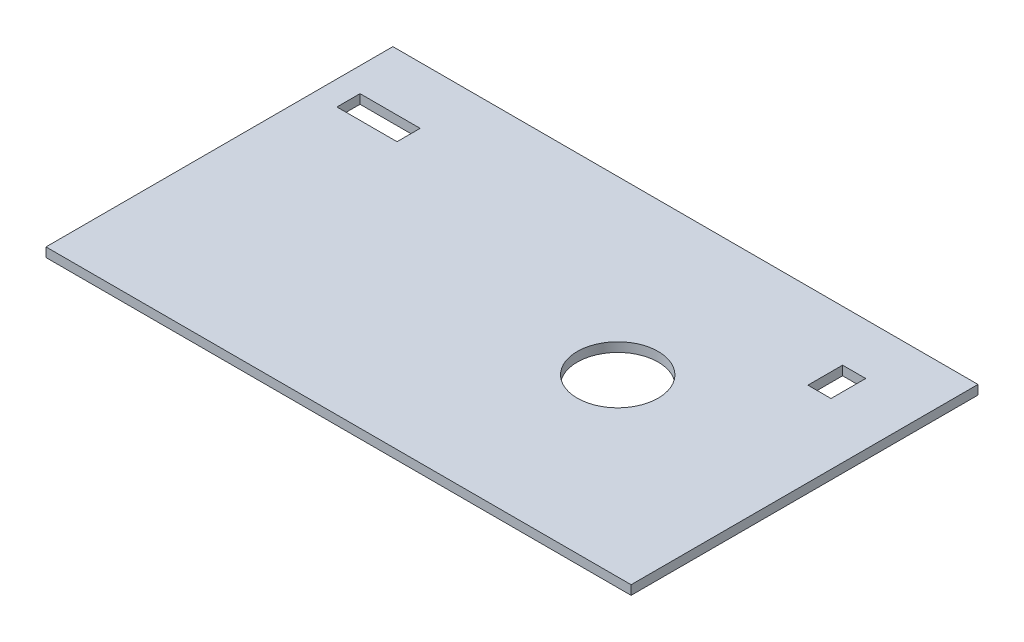
ISO-10303-21;
HEADER;
FILE_DESCRIPTION(('STEP AP214'),'2;1');
FILE_NAME('part.step','',(''),(''),'','','');
FILE_SCHEMA(('AUTOMOTIVE_DESIGN { 1 0 10303 214 1 1 1 1 }'));
ENDSEC;
DATA;
#1=APPLICATION_CONTEXT('core data for automotive mechanical design processes');
#2=APPLICATION_PROTOCOL_DEFINITION('international standard','automotive_design',2000,#1);
#3=PRODUCT_CONTEXT('',#1,'mechanical');
#4=PRODUCT('Part','Part','',(#3));
#5=PRODUCT_RELATED_PRODUCT_CATEGORY('part','',(#4));
#6=PRODUCT_DEFINITION_FORMATION('','',#4);
#7=PRODUCT_DEFINITION_CONTEXT('part definition',#1,'design');
#8=PRODUCT_DEFINITION('design','',#6,#7);
#9=PRODUCT_DEFINITION_SHAPE('','',#8);
#10=(LENGTH_UNIT() NAMED_UNIT(*) SI_UNIT(.MILLI.,.METRE.));
#11=(NAMED_UNIT(*) PLANE_ANGLE_UNIT() SI_UNIT($,.RADIAN.));
#12=(NAMED_UNIT(*) SI_UNIT($,.STERADIAN.) SOLID_ANGLE_UNIT());
#13=UNCERTAINTY_MEASURE_WITH_UNIT(LENGTH_MEASURE(1.E-05),#10,'distance_accuracy_value','');
#14=(GEOMETRIC_REPRESENTATION_CONTEXT(3) GLOBAL_UNCERTAINTY_ASSIGNED_CONTEXT((#13)) GLOBAL_UNIT_ASSIGNED_CONTEXT((#10,
#11,#12)) REPRESENTATION_CONTEXT('',''));
#15=CARTESIAN_POINT('',(0.,0.,0.));
#16=DIRECTION('',(0.,0.,1.));
#17=DIRECTION('',(1.,0.,0.));
#18=AXIS2_PLACEMENT_3D('',#15,#16,#17);
#19=CARTESIAN_POINT('',(-126.5,4.,-75.));
#20=DIRECTION('',(1.,0.,0.));
#21=DIRECTION('',(0.,0.,-1.));
#22=AXIS2_PLACEMENT_3D('',#19,#20,#21);
#23=PLANE('',#22);
#24=DIRECTION('',(0.,0.,1.));
#25=VECTOR('',#24,1.);
#26=CARTESIAN_POINT('',(-126.5,0.,-75.));
#27=LINE('',#26,#25);
#28=CARTESIAN_POINT('',(-126.5,0.,-75.));
#29=VERTEX_POINT('',#28);
#30=CARTESIAN_POINT('',(-126.5,0.,75.));
#31=VERTEX_POINT('',#30);
#32=EDGE_CURVE('E184',#29,#31,#27,.T.);
#33=ORIENTED_EDGE('',*,*,#32,.T.);
#34=DIRECTION('',(0.,-1.,0.));
#35=VECTOR('',#34,1.);
#36=CARTESIAN_POINT('',(-126.5,4.,75.));
#37=LINE('',#36,#35);
#38=CARTESIAN_POINT('',(-126.5,4.,75.));
#39=VERTEX_POINT('',#38);
#40=EDGE_CURVE('E12',#39,#31,#37,.T.);
#41=ORIENTED_EDGE('',*,*,#40,.F.);
#42=DIRECTION('',(0.,0.,1.));
#43=VECTOR('',#42,1.);
#44=CARTESIAN_POINT('',(-126.5,4.,-75.));
#45=LINE('',#44,#43);
#46=CARTESIAN_POINT('',(-126.5,4.,-75.));
#47=VERTEX_POINT('',#46);
#48=EDGE_CURVE('E244',#47,#39,#45,.T.);
#49=ORIENTED_EDGE('',*,*,#48,.F.);
#50=DIRECTION('',(0.,-1.,0.));
#51=VECTOR('',#50,1.);
#52=CARTESIAN_POINT('',(-126.5,4.,-75.));
#53=LINE('',#52,#51);
#54=EDGE_CURVE('E260',#47,#29,#53,.T.);
#55=ORIENTED_EDGE('',*,*,#54,.T.);
#56=EDGE_LOOP('',(#33,#41,#49,#55));
#57=FACE_BOUND('',#56,.T.);
#58=ADVANCED_FACE('F42',(#57),#23,.F.);
#59=CARTESIAN_POINT('',(126.5,4.,75.));
#60=DIRECTION('',(0.,0.,-1.));
#61=DIRECTION('',(-1.,0.,0.));
#62=AXIS2_PLACEMENT_3D('',#59,#60,#61);
#63=PLANE('',#62);
#64=DIRECTION('',(1.,0.,0.));
#65=VECTOR('',#64,1.);
#66=CARTESIAN_POINT('',(126.5,0.,75.));
#67=LINE('',#66,#65);
#68=CARTESIAN_POINT('',(126.5,0.,75.));
#69=VERTEX_POINT('',#68);
#70=EDGE_CURVE('E264',#31,#69,#67,.T.);
#71=ORIENTED_EDGE('',*,*,#70,.T.);
#72=DIRECTION('',(0.,-1.,0.));
#73=VECTOR('',#72,1.);
#74=CARTESIAN_POINT('',(126.5,4.,75.));
#75=LINE('',#74,#73);
#76=CARTESIAN_POINT('',(126.5,4.,75.));
#77=VERTEX_POINT('',#76);
#78=EDGE_CURVE('E50',#77,#69,#75,.T.);
#79=ORIENTED_EDGE('',*,*,#78,.F.);
#80=DIRECTION('',(1.,0.,0.));
#81=VECTOR('',#80,1.);
#82=CARTESIAN_POINT('',(126.5,4.,75.));
#83=LINE('',#82,#81);
#84=EDGE_CURVE('E250',#39,#77,#83,.T.);
#85=ORIENTED_EDGE('',*,*,#84,.F.);
#86=ORIENTED_EDGE('',*,*,#40,.T.);
#87=EDGE_LOOP('',(#71,#79,#85,#86));
#88=FACE_BOUND('',#87,.T.);
#89=ADVANCED_FACE('F302',(#88),#63,.F.);
#90=CARTESIAN_POINT('',(126.5,4.,-75.));
#91=DIRECTION('',(-1.,0.,0.));
#92=DIRECTION('',(0.,0.,1.));
#93=AXIS2_PLACEMENT_3D('',#90,#91,#92);
#94=PLANE('',#93);
#95=DIRECTION('',(0.,0.,-1.));
#96=VECTOR('',#95,1.);
#97=CARTESIAN_POINT('',(126.5,0.,-75.));
#98=LINE('',#97,#96);
#99=CARTESIAN_POINT('',(126.5,0.,-75.));
#100=VERTEX_POINT('',#99);
#101=EDGE_CURVE('E267',#69,#100,#98,.T.);
#102=ORIENTED_EDGE('',*,*,#101,.T.);
#103=DIRECTION('',(0.,-1.,0.));
#104=VECTOR('',#103,1.);
#105=CARTESIAN_POINT('',(126.5,4.,-75.));
#106=LINE('',#105,#104);
#107=CARTESIAN_POINT('',(126.5,4.,-75.));
#108=VERTEX_POINT('',#107);
#109=EDGE_CURVE('E276',#108,#100,#106,.T.);
#110=ORIENTED_EDGE('',*,*,#109,.F.);
#111=DIRECTION('',(0.,0.,-1.));
#112=VECTOR('',#111,1.);
#113=CARTESIAN_POINT('',(126.5,4.,-75.));
#114=LINE('',#113,#112);
#115=EDGE_CURVE('E253',#77,#108,#114,.T.);
#116=ORIENTED_EDGE('',*,*,#115,.F.);
#117=ORIENTED_EDGE('',*,*,#78,.T.);
#118=EDGE_LOOP('',(#102,#110,#116,#117));
#119=FACE_BOUND('',#118,.T.);
#120=ADVANCED_FACE('F285',(#119),#94,.F.);
#121=CARTESIAN_POINT('',(126.5,4.,-75.));
#122=DIRECTION('',(0.,0.,1.));
#123=DIRECTION('',(1.,0.,0.));
#124=AXIS2_PLACEMENT_3D('',#121,#122,#123);
#125=PLANE('',#124);
#126=DIRECTION('',(-1.,0.,0.));
#127=VECTOR('',#126,1.);
#128=CARTESIAN_POINT('',(126.5,0.,-75.));
#129=LINE('',#128,#127);
#130=EDGE_CURVE('E270',#100,#29,#129,.T.);
#131=ORIENTED_EDGE('',*,*,#130,.T.);
#132=ORIENTED_EDGE('',*,*,#54,.F.);
#133=DIRECTION('',(-1.,0.,0.));
#134=VECTOR('',#133,1.);
#135=CARTESIAN_POINT('',(126.5,4.,-75.));
#136=LINE('',#135,#134);
#137=EDGE_CURVE('E256',#108,#47,#136,.T.);
#138=ORIENTED_EDGE('',*,*,#137,.F.);
#139=ORIENTED_EDGE('',*,*,#109,.T.);
#140=EDGE_LOOP('',(#131,#132,#138,#139));
#141=FACE_BOUND('',#140,.T.);
#142=ADVANCED_FACE('F293',(#141),#125,.F.);
#143=CARTESIAN_POINT('',(0.,4.,0.));
#144=DIRECTION('',(0.,-1.,0.));
#145=DIRECTION('',(0.,0.,-1.));
#146=AXIS2_PLACEMENT_3D('',#143,#144,#145);
#147=PLANE('',#146);
#148=DIRECTION('',(1.,0.,0.));
#149=VECTOR('',#148,1.);
#150=CARTESIAN_POINT('',(-90.,4.,-40.2880576632511));
#151=LINE('',#150,#149);
#152=CARTESIAN_POINT('',(-116.,4.,-40.2880576632511));
#153=VERTEX_POINT('',#152);
#154=CARTESIAN_POINT('',(-90.,4.,-40.2880576632511));
#155=VERTEX_POINT('',#154);
#156=EDGE_CURVE('E169',#153,#155,#151,.T.);
#157=ORIENTED_EDGE('',*,*,#156,.F.);
#158=DIRECTION('',(0.,0.,1.));
#159=VECTOR('',#158,1.);
#160=CARTESIAN_POINT('',(-116.,4.,-50.2880576632511));
#161=LINE('',#160,#159);
#162=CARTESIAN_POINT('',(-116.,4.,-50.2880576632511));
#163=VERTEX_POINT('',#162);
#164=EDGE_CURVE('E57',#163,#153,#161,.T.);
#165=ORIENTED_EDGE('',*,*,#164,.F.);
#166=DIRECTION('',(-1.,0.,0.));
#167=VECTOR('',#166,1.);
#168=CARTESIAN_POINT('',(-90.,4.,-50.2880576632511));
#169=LINE('',#168,#167);
#170=CARTESIAN_POINT('',(-90.,4.,-50.2880576632511));
#171=VERTEX_POINT('',#170);
#172=EDGE_CURVE('E155',#171,#163,#169,.T.);
#173=ORIENTED_EDGE('',*,*,#172,.F.);
#174=DIRECTION('',(0.,0.,-1.));
#175=VECTOR('',#174,1.);
#176=CARTESIAN_POINT('',(-90.,4.,-50.2880576632511));
#177=LINE('',#176,#175);
#178=EDGE_CURVE('E159',#155,#171,#177,.T.);
#179=ORIENTED_EDGE('',*,*,#178,.F.);
#180=EDGE_LOOP('',(#157,#165,#173,#179));
#181=FACE_BOUND('',#180,.T.);
#182=DIRECTION('',(1.,0.,0.));
#183=VECTOR('',#182,1.);
#184=CARTESIAN_POINT('',(100.,4.,-37.9454055433295));
#185=LINE('',#184,#183);
#186=CARTESIAN_POINT('',(90.,4.,-37.9454055433295));
#187=VERTEX_POINT('',#186);
#188=CARTESIAN_POINT('',(100.,4.,-37.9454055433295));
#189=VERTEX_POINT('',#188);
#190=EDGE_CURVE('E211',#187,#189,#185,.T.);
#191=ORIENTED_EDGE('',*,*,#190,.F.);
#192=DIRECTION('',(0.,0.,1.));
#193=VECTOR('',#192,1.);
#194=CARTESIAN_POINT('',(90.,4.,-52.9454055433295));
#195=LINE('',#194,#193);
#196=CARTESIAN_POINT('',(90.,4.,-52.9454055433295));
#197=VERTEX_POINT('',#196);
#198=EDGE_CURVE('E65',#197,#187,#195,.T.);
#199=ORIENTED_EDGE('',*,*,#198,.F.);
#200=DIRECTION('',(-1.,0.,0.));
#201=VECTOR('',#200,1.);
#202=CARTESIAN_POINT('',(100.,4.,-52.9454055433295));
#203=LINE('',#202,#201);
#204=CARTESIAN_POINT('',(100.,4.,-52.9454055433295));
#205=VERTEX_POINT('',#204);
#206=EDGE_CURVE('E195',#205,#197,#203,.T.);
#207=ORIENTED_EDGE('',*,*,#206,.F.);
#208=DIRECTION('',(0.,0.,-1.));
#209=VECTOR('',#208,1.);
#210=CARTESIAN_POINT('',(100.,4.,-52.9454055433295));
#211=LINE('',#210,#209);
#212=EDGE_CURVE('E224',#189,#205,#211,.T.);
#213=ORIENTED_EDGE('',*,*,#212,.F.);
#214=EDGE_LOOP('',(#191,#199,#207,#213));
#215=FACE_BOUND('',#214,.T.);
#216=CARTESIAN_POINT('',(45.,4.,-0.713202337990988));
#217=DIRECTION('',(0.,1.,0.));
#218=DIRECTION('',(0.,0.,1.));
#219=AXIS2_PLACEMENT_3D('',#216,#217,#218);
#220=CIRCLE('',#219,17.5);
#221=CARTESIAN_POINT('',(45.,4.,16.786797662009));
#222=VERTEX_POINT('',#221);
#223=EDGE_CURVE('E239',#222,#222,#220,.T.);
#224=ORIENTED_EDGE('',*,*,#223,.F.);
#225=EDGE_LOOP('',(#224));
#226=FACE_BOUND('',#225,.T.);
#227=ORIENTED_EDGE('',*,*,#48,.T.);
#228=ORIENTED_EDGE('',*,*,#84,.T.);
#229=ORIENTED_EDGE('',*,*,#115,.T.);
#230=ORIENTED_EDGE('',*,*,#137,.T.);
#231=EDGE_LOOP('',(#227,#228,#229,#230));
#232=FACE_BOUND('',#231,.T.);
#233=ADVANCED_FACE('F301',(#181,#215,#226,#232),#147,.F.);
#234=CARTESIAN_POINT('',(0.,0.,0.));
#235=DIRECTION('',(0.,-1.,0.));
#236=DIRECTION('',(0.,0.,-1.));
#237=AXIS2_PLACEMENT_3D('',#234,#235,#236);
#238=PLANE('',#237);
#239=DIRECTION('',(0.,0.,1.));
#240=VECTOR('',#239,1.);
#241=CARTESIAN_POINT('',(-116.,0.,-50.2880576632511));
#242=LINE('',#241,#240);
#243=CARTESIAN_POINT('',(-116.,0.,-50.2880576632511));
#244=VERTEX_POINT('',#243);
#245=CARTESIAN_POINT('',(-116.,0.,-40.2880576632511));
#246=VERTEX_POINT('',#245);
#247=EDGE_CURVE('E133',#244,#246,#242,.T.);
#248=ORIENTED_EDGE('',*,*,#247,.T.);
#249=DIRECTION('',(1.,0.,0.));
#250=VECTOR('',#249,1.);
#251=CARTESIAN_POINT('',(-90.,0.,-40.2880576632511));
#252=LINE('',#251,#250);
#253=CARTESIAN_POINT('',(-90.,0.,-40.2880576632511));
#254=VERTEX_POINT('',#253);
#255=EDGE_CURVE('E144',#246,#254,#252,.T.);
#256=ORIENTED_EDGE('',*,*,#255,.T.);
#257=DIRECTION('',(0.,0.,-1.));
#258=VECTOR('',#257,1.);
#259=CARTESIAN_POINT('',(-90.,0.,-50.2880576632511));
#260=LINE('',#259,#258);
#261=CARTESIAN_POINT('',(-90.,0.,-50.2880576632511));
#262=VERTEX_POINT('',#261);
#263=EDGE_CURVE('E149',#254,#262,#260,.T.);
#264=ORIENTED_EDGE('',*,*,#263,.T.);
#265=DIRECTION('',(-1.,0.,0.));
#266=VECTOR('',#265,1.);
#267=CARTESIAN_POINT('',(-90.,0.,-50.2880576632511));
#268=LINE('',#267,#266);
#269=EDGE_CURVE('E140',#262,#244,#268,.T.);
#270=ORIENTED_EDGE('',*,*,#269,.T.);
#271=EDGE_LOOP('',(#248,#256,#264,#270));
#272=FACE_BOUND('',#271,.T.);
#273=DIRECTION('',(0.,0.,1.));
#274=VECTOR('',#273,1.);
#275=CARTESIAN_POINT('',(90.,0.,-52.9454055433295));
#276=LINE('',#275,#274);
#277=CARTESIAN_POINT('',(90.,0.,-52.9454055433295));
#278=VERTEX_POINT('',#277);
#279=CARTESIAN_POINT('',(90.,0.,-37.9454055433295));
#280=VERTEX_POINT('',#279);
#281=EDGE_CURVE('E190',#278,#280,#276,.T.);
#282=ORIENTED_EDGE('',*,*,#281,.T.);
#283=DIRECTION('',(1.,0.,0.));
#284=VECTOR('',#283,1.);
#285=CARTESIAN_POINT('',(100.,0.,-37.9454055433295));
#286=LINE('',#285,#284);
#287=CARTESIAN_POINT('',(100.,0.,-37.9454055433295));
#288=VERTEX_POINT('',#287);
#289=EDGE_CURVE('E194',#280,#288,#286,.T.);
#290=ORIENTED_EDGE('',*,*,#289,.T.);
#291=DIRECTION('',(0.,0.,-1.));
#292=VECTOR('',#291,1.);
#293=CARTESIAN_POINT('',(100.,0.,-52.9454055433295));
#294=LINE('',#293,#292);
#295=CARTESIAN_POINT('',(100.,0.,-52.9454055433295));
#296=VERTEX_POINT('',#295);
#297=EDGE_CURVE('E199',#288,#296,#294,.T.);
#298=ORIENTED_EDGE('',*,*,#297,.T.);
#299=DIRECTION('',(-1.,0.,0.));
#300=VECTOR('',#299,1.);
#301=CARTESIAN_POINT('',(100.,0.,-52.9454055433295));
#302=LINE('',#301,#300);
#303=EDGE_CURVE('E203',#296,#278,#302,.T.);
#304=ORIENTED_EDGE('',*,*,#303,.T.);
#305=EDGE_LOOP('',(#282,#290,#298,#304));
#306=FACE_BOUND('',#305,.T.);
#307=CARTESIAN_POINT('',(45.,0.,-0.713202337990988));
#308=DIRECTION('',(0.,1.,0.));
#309=DIRECTION('',(0.,0.,1.));
#310=AXIS2_PLACEMENT_3D('',#307,#308,#309);
#311=CIRCLE('',#310,17.5);
#312=CARTESIAN_POINT('',(45.,0.,16.786797662009));
#313=VERTEX_POINT('',#312);
#314=EDGE_CURVE('E212',#313,#313,#311,.T.);
#315=ORIENTED_EDGE('',*,*,#314,.T.);
#316=EDGE_LOOP('',(#315));
#317=FACE_BOUND('',#316,.T.);
#318=ORIENTED_EDGE('',*,*,#32,.F.);
#319=ORIENTED_EDGE('',*,*,#130,.F.);
#320=ORIENTED_EDGE('',*,*,#101,.F.);
#321=ORIENTED_EDGE('',*,*,#70,.F.);
#322=EDGE_LOOP('',(#318,#319,#320,#321));
#323=FACE_BOUND('',#322,.T.);
#324=ADVANCED_FACE('F151',(#272,#306,#317,#323),#238,.T.);
#325=CARTESIAN_POINT('',(45.,0.,-0.713202337990988));
#326=DIRECTION('',(0.,1.,0.));
#327=DIRECTION('',(0.,0.,1.));
#328=AXIS2_PLACEMENT_3D('',#325,#326,#327);
#329=CYLINDRICAL_SURFACE('',#328,17.5);
#330=ORIENTED_EDGE('',*,*,#314,.F.);
#331=EDGE_LOOP('',(#330));
#332=FACE_BOUND('',#331,.T.);
#333=ORIENTED_EDGE('',*,*,#223,.T.);
#334=EDGE_LOOP('',(#333));
#335=FACE_BOUND('',#334,.T.);
#336=ADVANCED_FACE('F314',(#332,#335),#329,.F.);
#337=CARTESIAN_POINT('',(90.,0.,-52.9454055433295));
#338=DIRECTION('',(-1.,0.,0.));
#339=DIRECTION('',(0.,0.,1.));
#340=AXIS2_PLACEMENT_3D('',#337,#338,#339);
#341=PLANE('',#340);
#342=ORIENTED_EDGE('',*,*,#198,.T.);
#343=DIRECTION('',(0.,1.,0.));
#344=VECTOR('',#343,1.);
#345=CARTESIAN_POINT('',(90.,0.,-37.9454055433295));
#346=LINE('',#345,#344);
#347=EDGE_CURVE('E207',#280,#187,#346,.T.);
#348=ORIENTED_EDGE('',*,*,#347,.F.);
#349=ORIENTED_EDGE('',*,*,#281,.F.);
#350=DIRECTION('',(0.,1.,0.));
#351=VECTOR('',#350,1.);
#352=CARTESIAN_POINT('',(90.,0.,-52.9454055433295));
#353=LINE('',#352,#351);
#354=EDGE_CURVE('E170',#278,#197,#353,.T.);
#355=ORIENTED_EDGE('',*,*,#354,.T.);
#356=EDGE_LOOP('',(#342,#348,#349,#355));
#357=FACE_BOUND('',#356,.T.);
#358=ADVANCED_FACE('F320',(#357),#341,.F.);
#359=CARTESIAN_POINT('',(100.,0.,-52.9454055433295));
#360=DIRECTION('',(0.,0.,-1.));
#361=DIRECTION('',(-1.,0.,0.));
#362=AXIS2_PLACEMENT_3D('',#359,#360,#361);
#363=PLANE('',#362);
#364=ORIENTED_EDGE('',*,*,#206,.T.);
#365=ORIENTED_EDGE('',*,*,#354,.F.);
#366=ORIENTED_EDGE('',*,*,#303,.F.);
#367=DIRECTION('',(0.,1.,0.));
#368=VECTOR('',#367,1.);
#369=CARTESIAN_POINT('',(100.,0.,-52.9454055433295));
#370=LINE('',#369,#368);
#371=EDGE_CURVE('E228',#296,#205,#370,.T.);
#372=ORIENTED_EDGE('',*,*,#371,.T.);
#373=EDGE_LOOP('',(#364,#365,#366,#372));
#374=FACE_BOUND('',#373,.T.);
#375=ADVANCED_FACE('F324',(#374),#363,.F.);
#376=CARTESIAN_POINT('',(100.,0.,-52.9454055433295));
#377=DIRECTION('',(1.,0.,0.));
#378=DIRECTION('',(0.,0.,-1.));
#379=AXIS2_PLACEMENT_3D('',#376,#377,#378);
#380=PLANE('',#379);
#381=ORIENTED_EDGE('',*,*,#212,.T.);
#382=ORIENTED_EDGE('',*,*,#371,.F.);
#383=ORIENTED_EDGE('',*,*,#297,.F.);
#384=DIRECTION('',(0.,1.,0.));
#385=VECTOR('',#384,1.);
#386=CARTESIAN_POINT('',(100.,0.,-37.9454055433295));
#387=LINE('',#386,#385);
#388=EDGE_CURVE('E231',#288,#189,#387,.T.);
#389=ORIENTED_EDGE('',*,*,#388,.T.);
#390=EDGE_LOOP('',(#381,#382,#383,#389));
#391=FACE_BOUND('',#390,.T.);
#392=ADVANCED_FACE('F328',(#391),#380,.F.);
#393=CARTESIAN_POINT('',(100.,0.,-37.9454055433295));
#394=DIRECTION('',(0.,0.,1.));
#395=DIRECTION('',(1.,0.,0.));
#396=AXIS2_PLACEMENT_3D('',#393,#394,#395);
#397=PLANE('',#396);
#398=ORIENTED_EDGE('',*,*,#190,.T.);
#399=ORIENTED_EDGE('',*,*,#388,.F.);
#400=ORIENTED_EDGE('',*,*,#289,.F.);
#401=ORIENTED_EDGE('',*,*,#347,.T.);
#402=EDGE_LOOP('',(#398,#399,#400,#401));
#403=FACE_BOUND('',#402,.T.);
#404=ADVANCED_FACE('F325',(#403),#397,.F.);
#405=CARTESIAN_POINT('',(-116.,0.,-50.2880576632511));
#406=DIRECTION('',(-1.,0.,0.));
#407=DIRECTION('',(0.,0.,1.));
#408=AXIS2_PLACEMENT_3D('',#405,#406,#407);
#409=PLANE('',#408);
#410=ORIENTED_EDGE('',*,*,#164,.T.);
#411=DIRECTION('',(0.,1.,0.));
#412=VECTOR('',#411,1.);
#413=CARTESIAN_POINT('',(-116.,0.,-40.2880576632511));
#414=LINE('',#413,#412);
#415=EDGE_CURVE('E129',#246,#153,#414,.T.);
#416=ORIENTED_EDGE('',*,*,#415,.F.);
#417=ORIENTED_EDGE('',*,*,#247,.F.);
#418=DIRECTION('',(0.,1.,0.));
#419=VECTOR('',#418,1.);
#420=CARTESIAN_POINT('',(-116.,0.,-50.2880576632511));
#421=LINE('',#420,#419);
#422=EDGE_CURVE('E181',#244,#163,#421,.T.);
#423=ORIENTED_EDGE('',*,*,#422,.T.);
#424=EDGE_LOOP('',(#410,#416,#417,#423));
#425=FACE_BOUND('',#424,.T.);
#426=ADVANCED_FACE('F131',(#425),#409,.F.);
#427=CARTESIAN_POINT('',(-90.,0.,-50.2880576632511));
#428=DIRECTION('',(0.,0.,-1.));
#429=DIRECTION('',(-1.,0.,0.));
#430=AXIS2_PLACEMENT_3D('',#427,#428,#429);
#431=PLANE('',#430);
#432=ORIENTED_EDGE('',*,*,#172,.T.);
#433=ORIENTED_EDGE('',*,*,#422,.F.);
#434=ORIENTED_EDGE('',*,*,#269,.F.);
#435=DIRECTION('',(0.,1.,0.));
#436=VECTOR('',#435,1.);
#437=CARTESIAN_POINT('',(-90.,0.,-50.2880576632511));
#438=LINE('',#437,#436);
#439=EDGE_CURVE('E185',#262,#171,#438,.T.);
#440=ORIENTED_EDGE('',*,*,#439,.T.);
#441=EDGE_LOOP('',(#432,#433,#434,#440));
#442=FACE_BOUND('',#441,.T.);
#443=ADVANCED_FACE('F338',(#442),#431,.F.);
#444=CARTESIAN_POINT('',(-90.,0.,-50.2880576632511));
#445=DIRECTION('',(1.,0.,0.));
#446=DIRECTION('',(0.,0.,-1.));
#447=AXIS2_PLACEMENT_3D('',#444,#445,#446);
#448=PLANE('',#447);
#449=ORIENTED_EDGE('',*,*,#178,.T.);
#450=ORIENTED_EDGE('',*,*,#439,.F.);
#451=ORIENTED_EDGE('',*,*,#263,.F.);
#452=DIRECTION('',(0.,1.,0.));
#453=VECTOR('',#452,1.);
#454=CARTESIAN_POINT('',(-90.,0.,-40.2880576632511));
#455=LINE('',#454,#453);
#456=EDGE_CURVE('E139',#254,#155,#455,.T.);
#457=ORIENTED_EDGE('',*,*,#456,.T.);
#458=EDGE_LOOP('',(#449,#450,#451,#457));
#459=FACE_BOUND('',#458,.T.);
#460=ADVANCED_FACE('F341',(#459),#448,.F.);
#461=CARTESIAN_POINT('',(-90.,0.,-40.2880576632511));
#462=DIRECTION('',(0.,0.,1.));
#463=DIRECTION('',(1.,0.,0.));
#464=AXIS2_PLACEMENT_3D('',#461,#462,#463);
#465=PLANE('',#464);
#466=ORIENTED_EDGE('',*,*,#156,.T.);
#467=ORIENTED_EDGE('',*,*,#456,.F.);
#468=ORIENTED_EDGE('',*,*,#255,.F.);
#469=ORIENTED_EDGE('',*,*,#415,.T.);
#470=EDGE_LOOP('',(#466,#467,#468,#469));
#471=FACE_BOUND('',#470,.T.);
#472=ADVANCED_FACE('F145',(#471),#465,.F.);
#473=CLOSED_SHELL('',(#58,#89,#120,#142,#233,#324,#336,#358,#375,#392,#404,#426,#443,#460,#472));
#474=MANIFOLD_SOLID_BREP('B2',#473);
#475=ADVANCED_BREP_SHAPE_REPRESENTATION('',(#18,#474),#14);
#476=SHAPE_DEFINITION_REPRESENTATION(#9,#475);
ENDSEC;
END-ISO-10303-21;
